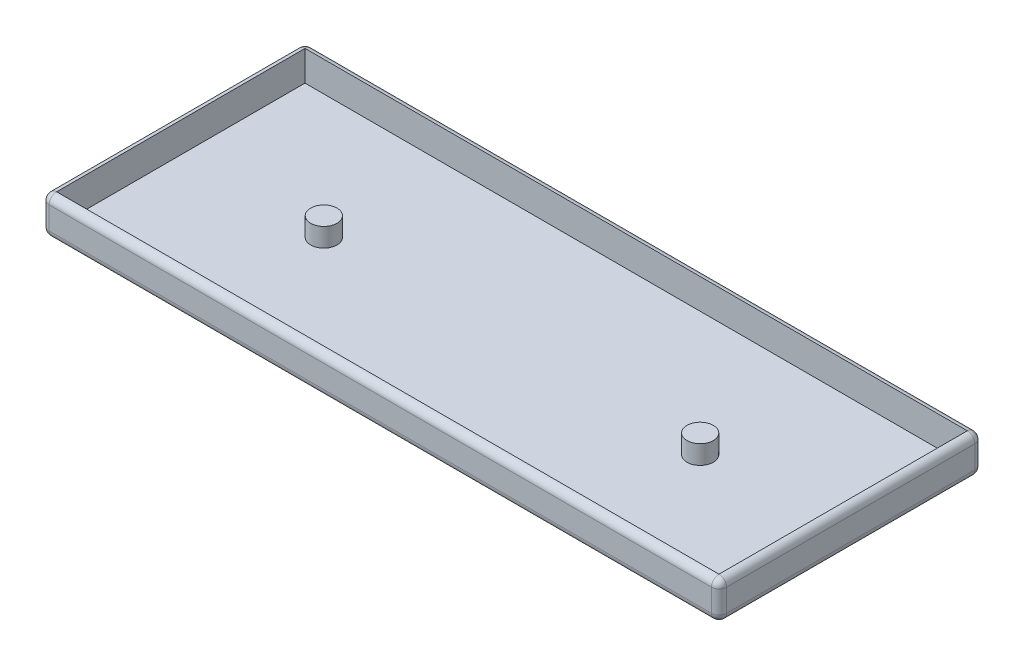
ISO-10303-21;
HEADER;
FILE_DESCRIPTION(('STEP AP214'),'2;1');
FILE_NAME('part.step','',(''),(''),'','','');
FILE_SCHEMA(('AUTOMOTIVE_DESIGN { 1 0 10303 214 1 1 1 1 }'));
ENDSEC;
DATA;
#1=APPLICATION_CONTEXT('core data for automotive mechanical design processes');
#2=APPLICATION_PROTOCOL_DEFINITION('international standard','automotive_design',2000,#1);
#3=PRODUCT_CONTEXT('',#1,'mechanical');
#4=PRODUCT('Part','Part','',(#3));
#5=PRODUCT_RELATED_PRODUCT_CATEGORY('part','',(#4));
#6=PRODUCT_DEFINITION_FORMATION('','',#4);
#7=PRODUCT_DEFINITION_CONTEXT('part definition',#1,'design');
#8=PRODUCT_DEFINITION('design','',#6,#7);
#9=PRODUCT_DEFINITION_SHAPE('','',#8);
#10=(LENGTH_UNIT() NAMED_UNIT(*) SI_UNIT(.MILLI.,.METRE.));
#11=(NAMED_UNIT(*) PLANE_ANGLE_UNIT() SI_UNIT($,.RADIAN.));
#12=(NAMED_UNIT(*) SI_UNIT($,.STERADIAN.) SOLID_ANGLE_UNIT());
#13=UNCERTAINTY_MEASURE_WITH_UNIT(LENGTH_MEASURE(1.E-05),#10,'distance_accuracy_value','');
#14=(GEOMETRIC_REPRESENTATION_CONTEXT(3) GLOBAL_UNCERTAINTY_ASSIGNED_CONTEXT((#13)) GLOBAL_UNIT_ASSIGNED_CONTEXT((#10,
#11,#12)) REPRESENTATION_CONTEXT('',''));
#15=CARTESIAN_POINT('',(0.,0.,0.));
#16=DIRECTION('',(0.,0.,1.));
#17=DIRECTION('',(1.,0.,0.));
#18=AXIS2_PLACEMENT_3D('',#15,#16,#17);
#19=CARTESIAN_POINT('',(90.,10.,35.));
#20=DIRECTION('',(-1.,0.,0.));
#21=DIRECTION('',(0.,0.,1.));
#22=AXIS2_PLACEMENT_3D('',#19,#20,#21);
#23=PLANE('',#22);
#24=DIRECTION('',(0.,-1.,0.));
#25=VECTOR('',#24,1.);
#26=CARTESIAN_POINT('',(90.,10.,33.));
#27=LINE('',#26,#25);
#28=CARTESIAN_POINT('',(90.,8.,33.));
#29=VERTEX_POINT('',#28);
#30=CARTESIAN_POINT('',(90.,2.,33.));
#31=VERTEX_POINT('',#30);
#32=EDGE_CURVE('E191',#29,#31,#27,.T.);
#33=ORIENTED_EDGE('',*,*,#32,.T.);
#34=DIRECTION('',(0.,0.,-1.));
#35=VECTOR('',#34,1.);
#36=CARTESIAN_POINT('',(90.,2.,-35.));
#37=LINE('',#36,#35);
#38=CARTESIAN_POINT('',(90.,2.,-33.));
#39=VERTEX_POINT('',#38);
#40=EDGE_CURVE('E193',#31,#39,#37,.T.);
#41=ORIENTED_EDGE('',*,*,#40,.T.);
#42=DIRECTION('',(0.,-1.,0.));
#43=VECTOR('',#42,1.);
#44=CARTESIAN_POINT('',(90.,10.,-33.));
#45=LINE('',#44,#43);
#46=CARTESIAN_POINT('',(90.,8.,-33.));
#47=VERTEX_POINT('',#46);
#48=EDGE_CURVE('E185',#39,#47,#45,.F.);
#49=ORIENTED_EDGE('',*,*,#48,.T.);
#50=DIRECTION('',(0.,0.,-1.));
#51=VECTOR('',#50,1.);
#52=CARTESIAN_POINT('',(90.,8.,35.));
#53=LINE('',#52,#51);
#54=EDGE_CURVE('E189',#47,#29,#53,.F.);
#55=ORIENTED_EDGE('',*,*,#54,.T.);
#56=EDGE_LOOP('',(#33,#41,#49,#55));
#57=FACE_BOUND('',#56,.T.);
#58=ADVANCED_FACE('F33',(#57),#23,.F.);
#59=CARTESIAN_POINT('',(-90.,10.,-35.));
#60=DIRECTION('',(0.,0.,1.));
#61=DIRECTION('',(1.,0.,0.));
#62=AXIS2_PLACEMENT_3D('',#59,#60,#61);
#63=PLANE('',#62);
#64=DIRECTION('',(-1.,0.,0.));
#65=VECTOR('',#64,1.);
#66=CARTESIAN_POINT('',(-90.,8.,-35.));
#67=LINE('',#66,#65);
#68=CARTESIAN_POINT('',(-88.,8.,-35.));
#69=VERTEX_POINT('',#68);
#70=CARTESIAN_POINT('',(88.,8.,-35.));
#71=VERTEX_POINT('',#70);
#72=EDGE_CURVE('E42',#69,#71,#67,.F.);
#73=ORIENTED_EDGE('',*,*,#72,.T.);
#74=DIRECTION('',(0.,-1.,0.));
#75=VECTOR('',#74,1.);
#76=CARTESIAN_POINT('',(88.,10.,-35.));
#77=LINE('',#76,#75);
#78=CARTESIAN_POINT('',(88.,2.,-35.));
#79=VERTEX_POINT('',#78);
#80=EDGE_CURVE('E11',#71,#79,#77,.T.);
#81=ORIENTED_EDGE('',*,*,#80,.T.);
#82=DIRECTION('',(-1.,0.,0.));
#83=VECTOR('',#82,1.);
#84=CARTESIAN_POINT('',(-90.,2.,-35.));
#85=LINE('',#84,#83);
#86=CARTESIAN_POINT('',(-88.,2.,-35.));
#87=VERTEX_POINT('',#86);
#88=EDGE_CURVE('E232',#79,#87,#85,.T.);
#89=ORIENTED_EDGE('',*,*,#88,.T.);
#90=DIRECTION('',(0.,-1.,0.));
#91=VECTOR('',#90,1.);
#92=CARTESIAN_POINT('',(-88.,10.,-35.));
#93=LINE('',#92,#91);
#94=EDGE_CURVE('E53',#87,#69,#93,.F.);
#95=ORIENTED_EDGE('',*,*,#94,.T.);
#96=EDGE_LOOP('',(#73,#81,#89,#95));
#97=FACE_BOUND('',#96,.T.);
#98=ADVANCED_FACE('F362',(#97),#63,.F.);
#99=CARTESIAN_POINT('',(-90.,10.,35.));
#100=DIRECTION('',(1.,0.,0.));
#101=DIRECTION('',(0.,0.,-1.));
#102=AXIS2_PLACEMENT_3D('',#99,#100,#101);
#103=PLANE('',#102);
#104=DIRECTION('',(0.,0.,1.));
#105=VECTOR('',#104,1.);
#106=CARTESIAN_POINT('',(-90.,2.,35.));
#107=LINE('',#106,#105);
#108=CARTESIAN_POINT('',(-90.,2.,-33.));
#109=VERTEX_POINT('',#108);
#110=CARTESIAN_POINT('',(-90.,2.,33.));
#111=VERTEX_POINT('',#110);
#112=EDGE_CURVE('E218',#109,#111,#107,.T.);
#113=ORIENTED_EDGE('',*,*,#112,.T.);
#114=DIRECTION('',(0.,-1.,0.));
#115=VECTOR('',#114,1.);
#116=CARTESIAN_POINT('',(-90.,10.,33.));
#117=LINE('',#116,#115);
#118=CARTESIAN_POINT('',(-90.,8.,33.));
#119=VERTEX_POINT('',#118);
#120=EDGE_CURVE('E220',#111,#119,#117,.F.);
#121=ORIENTED_EDGE('',*,*,#120,.T.);
#122=DIRECTION('',(0.,0.,1.));
#123=VECTOR('',#122,1.);
#124=CARTESIAN_POINT('',(-90.,8.,35.));
#125=LINE('',#124,#123);
#126=CARTESIAN_POINT('',(-90.,8.,-33.));
#127=VERTEX_POINT('',#126);
#128=EDGE_CURVE('E216',#119,#127,#125,.F.);
#129=ORIENTED_EDGE('',*,*,#128,.T.);
#130=DIRECTION('',(0.,-1.,0.));
#131=VECTOR('',#130,1.);
#132=CARTESIAN_POINT('',(-90.,10.,-33.));
#133=LINE('',#132,#131);
#134=EDGE_CURVE('E214',#127,#109,#133,.T.);
#135=ORIENTED_EDGE('',*,*,#134,.T.);
#136=EDGE_LOOP('',(#113,#121,#129,#135));
#137=FACE_BOUND('',#136,.T.);
#138=ADVANCED_FACE('F313',(#137),#103,.F.);
#139=CARTESIAN_POINT('',(-90.,10.,35.));
#140=DIRECTION('',(0.,0.,-1.));
#141=DIRECTION('',(-1.,0.,0.));
#142=AXIS2_PLACEMENT_3D('',#139,#140,#141);
#143=PLANE('',#142);
#144=DIRECTION('',(1.,0.,0.));
#145=VECTOR('',#144,1.);
#146=CARTESIAN_POINT('',(90.,2.,35.));
#147=LINE('',#146,#145);
#148=CARTESIAN_POINT('',(-88.,2.,35.));
#149=VERTEX_POINT('',#148);
#150=CARTESIAN_POINT('',(88.,2.,35.));
#151=VERTEX_POINT('',#150);
#152=EDGE_CURVE('E209',#149,#151,#147,.T.);
#153=ORIENTED_EDGE('',*,*,#152,.T.);
#154=DIRECTION('',(0.,-1.,0.));
#155=VECTOR('',#154,1.);
#156=CARTESIAN_POINT('',(88.,10.,35.));
#157=LINE('',#156,#155);
#158=CARTESIAN_POINT('',(88.,8.,35.));
#159=VERTEX_POINT('',#158);
#160=EDGE_CURVE('E211',#151,#159,#157,.F.);
#161=ORIENTED_EDGE('',*,*,#160,.T.);
#162=DIRECTION('',(1.,0.,0.));
#163=VECTOR('',#162,1.);
#164=CARTESIAN_POINT('',(-90.,8.,35.));
#165=LINE('',#164,#163);
#166=CARTESIAN_POINT('',(-88.,8.,35.));
#167=VERTEX_POINT('',#166);
#168=EDGE_CURVE('E205',#159,#167,#165,.F.);
#169=ORIENTED_EDGE('',*,*,#168,.T.);
#170=DIRECTION('',(0.,-1.,0.));
#171=VECTOR('',#170,1.);
#172=CARTESIAN_POINT('',(-88.,10.,35.));
#173=LINE('',#172,#171);
#174=EDGE_CURVE('E207',#167,#149,#173,.T.);
#175=ORIENTED_EDGE('',*,*,#174,.T.);
#176=EDGE_LOOP('',(#153,#161,#169,#175));
#177=FACE_BOUND('',#176,.T.);
#178=ADVANCED_FACE('F334',(#177),#143,.F.);
#179=CARTESIAN_POINT('',(0.,0.,0.));
#180=DIRECTION('',(0.,-1.,0.));
#181=DIRECTION('',(0.,0.,-1.));
#182=AXIS2_PLACEMENT_3D('',#179,#180,#181);
#183=PLANE('',#182);
#184=DIRECTION('',(-1.,0.,0.));
#185=VECTOR('',#184,1.);
#186=CARTESIAN_POINT('',(90.,0.,-33.));
#187=LINE('',#186,#185);
#188=CARTESIAN_POINT('',(-88.,0.,-33.));
#189=VERTEX_POINT('',#188);
#190=CARTESIAN_POINT('',(88.,0.,-33.));
#191=VERTEX_POINT('',#190);
#192=EDGE_CURVE('E196',#189,#191,#187,.F.);
#193=ORIENTED_EDGE('',*,*,#192,.T.);
#194=DIRECTION('',(0.,0.,-1.));
#195=VECTOR('',#194,1.);
#196=CARTESIAN_POINT('',(88.,0.,35.));
#197=LINE('',#196,#195);
#198=CARTESIAN_POINT('',(88.,0.,33.));
#199=VERTEX_POINT('',#198);
#200=EDGE_CURVE('E202',#191,#199,#197,.F.);
#201=ORIENTED_EDGE('',*,*,#200,.T.);
#202=DIRECTION('',(1.,0.,0.));
#203=VECTOR('',#202,1.);
#204=CARTESIAN_POINT('',(-90.,0.,33.));
#205=LINE('',#204,#203);
#206=CARTESIAN_POINT('',(-88.,0.,33.));
#207=VERTEX_POINT('',#206);
#208=EDGE_CURVE('E200',#199,#207,#205,.F.);
#209=ORIENTED_EDGE('',*,*,#208,.T.);
#210=DIRECTION('',(0.,0.,1.));
#211=VECTOR('',#210,1.);
#212=CARTESIAN_POINT('',(-88.,0.,-35.));
#213=LINE('',#212,#211);
#214=EDGE_CURVE('E198',#207,#189,#213,.F.);
#215=ORIENTED_EDGE('',*,*,#214,.T.);
#216=EDGE_LOOP('',(#193,#201,#209,#215));
#217=FACE_BOUND('',#216,.T.);
#218=CARTESIAN_POINT('',(-50.,0.,0.));
#219=DIRECTION('',(0.,1.,0.));
#220=DIRECTION('',(0.,0.,-1.));
#221=AXIS2_PLACEMENT_3D('',#218,#219,#220);
#222=CIRCLE('',#221,1.5);
#223=CARTESIAN_POINT('',(-50.,0.,-1.5));
#224=VERTEX_POINT('',#223);
#225=EDGE_CURVE('E179',#224,#224,#222,.T.);
#226=ORIENTED_EDGE('',*,*,#225,.T.);
#227=EDGE_LOOP('',(#226));
#228=FACE_BOUND('',#227,.T.);
#229=CARTESIAN_POINT('',(50.,0.,0.));
#230=DIRECTION('',(0.,-1.,0.));
#231=DIRECTION('',(0.,0.,-1.));
#232=AXIS2_PLACEMENT_3D('',#229,#230,#231);
#233=CIRCLE('',#232,1.5);
#234=CARTESIAN_POINT('',(50.,0.,-1.5));
#235=VERTEX_POINT('',#234);
#236=EDGE_CURVE('E178',#235,#235,#233,.T.);
#237=ORIENTED_EDGE('',*,*,#236,.F.);
#238=EDGE_LOOP('',(#237));
#239=FACE_BOUND('',#238,.T.);
#240=ADVANCED_FACE('F426',(#217,#228,#239),#183,.T.);
#241=CARTESIAN_POINT('',(50.,5.,0.));
#242=DIRECTION('',(0.,-1.,0.));
#243=DIRECTION('',(0.,0.,-1.));
#244=AXIS2_PLACEMENT_3D('',#241,#242,#243);
#245=CYLINDRICAL_SURFACE('',#244,1.5);
#246=CARTESIAN_POINT('',(50.,5.,0.));
#247=DIRECTION('',(0.,-1.,0.));
#248=DIRECTION('',(0.,0.,-1.));
#249=AXIS2_PLACEMENT_3D('',#246,#247,#248);
#250=CIRCLE('',#249,1.5);
#251=CARTESIAN_POINT('',(50.,5.,-1.5));
#252=VERTEX_POINT('',#251);
#253=EDGE_CURVE('E182',#252,#252,#250,.T.);
#254=ORIENTED_EDGE('',*,*,#253,.F.);
#255=EDGE_LOOP('',(#254));
#256=FACE_BOUND('',#255,.T.);
#257=ORIENTED_EDGE('',*,*,#236,.T.);
#258=EDGE_LOOP('',(#257));
#259=FACE_BOUND('',#258,.T.);
#260=ADVANCED_FACE('F482',(#256,#259),#245,.F.);
#261=CARTESIAN_POINT('',(50.,5.,0.));
#262=DIRECTION('',(0.,-1.,0.));
#263=DIRECTION('',(0.,0.,-1.));
#264=AXIS2_PLACEMENT_3D('',#261,#262,#263);
#265=PLANE('',#264);
#266=ORIENTED_EDGE('',*,*,#253,.T.);
#267=EDGE_LOOP('',(#266));
#268=FACE_BOUND('',#267,.T.);
#269=ADVANCED_FACE('F478',(#268),#265,.T.);
#270=CARTESIAN_POINT('',(-50.,5.,0.));
#271=DIRECTION('',(0.,-1.,0.));
#272=DIRECTION('',(0.,0.,-1.));
#273=AXIS2_PLACEMENT_3D('',#270,#271,#272);
#274=CYLINDRICAL_SURFACE('',#273,1.5);
#275=CARTESIAN_POINT('',(-50.,5.,0.));
#276=DIRECTION('',(0.,1.,0.));
#277=DIRECTION('',(0.,0.,-1.));
#278=AXIS2_PLACEMENT_3D('',#275,#276,#277);
#279=CIRCLE('',#278,1.5);
#280=CARTESIAN_POINT('',(-50.,5.,-1.5));
#281=VERTEX_POINT('',#280);
#282=EDGE_CURVE('E175',#281,#281,#279,.T.);
#283=ORIENTED_EDGE('',*,*,#282,.T.);
#284=EDGE_LOOP('',(#283));
#285=FACE_BOUND('',#284,.T.);
#286=ORIENTED_EDGE('',*,*,#225,.F.);
#287=EDGE_LOOP('',(#286));
#288=FACE_BOUND('',#287,.T.);
#289=ADVANCED_FACE('F474',(#285,#288),#274,.F.);
#290=CARTESIAN_POINT('',(-50.,5.,0.));
#291=DIRECTION('',(0.,-1.,0.));
#292=DIRECTION('',(0.,0.,-1.));
#293=AXIS2_PLACEMENT_3D('',#290,#291,#292);
#294=PLANE('',#293);
#295=ORIENTED_EDGE('',*,*,#282,.F.);
#296=EDGE_LOOP('',(#295));
#297=FACE_BOUND('',#296,.T.);
#298=ADVANCED_FACE('F471',(#297),#294,.T.);
#299=CARTESIAN_POINT('',(-88.,8.,0.));
#300=DIRECTION('',(0.,0.,1.));
#301=DIRECTION('',(1.,0.,0.));
#302=AXIS2_PLACEMENT_3D('',#299,#300,#301);
#303=CYLINDRICAL_SURFACE('',#302,2.);
#304=CARTESIAN_POINT('',(-88.,8.,33.));
#305=DIRECTION('',(0.,0.,1.));
#306=DIRECTION('',(1.,0.,0.));
#307=AXIS2_PLACEMENT_3D('',#304,#305,#306);
#308=CIRCLE('',#307,2.);
#309=CARTESIAN_POINT('',(-88.,10.,33.));
#310=VERTEX_POINT('',#309);
#311=EDGE_CURVE('E37',#310,#119,#308,.T.);
#312=ORIENTED_EDGE('',*,*,#311,.F.);
#313=DIRECTION('',(0.,0.,1.));
#314=VECTOR('',#313,1.);
#315=CARTESIAN_POINT('',(-88.,10.,0.));
#316=LINE('',#315,#314);
#317=CARTESIAN_POINT('',(-88.,10.,-33.));
#318=VERTEX_POINT('',#317);
#319=EDGE_CURVE('E228',#318,#310,#316,.T.);
#320=ORIENTED_EDGE('',*,*,#319,.F.);
#321=CARTESIAN_POINT('',(-88.,8.,-33.));
#322=DIRECTION('',(0.,0.,-1.));
#323=DIRECTION('',(-1.,0.,0.));
#324=AXIS2_PLACEMENT_3D('',#321,#322,#323);
#325=CIRCLE('',#324,2.);
#326=EDGE_CURVE('E295',#127,#318,#325,.T.);
#327=ORIENTED_EDGE('',*,*,#326,.F.);
#328=ORIENTED_EDGE('',*,*,#128,.F.);
#329=EDGE_LOOP('',(#312,#320,#327,#328));
#330=FACE_BOUND('',#329,.T.);
#331=ADVANCED_FACE('F35',(#330),#303,.T.);
#332=CARTESIAN_POINT('',(-88.,8.,33.));
#333=DIRECTION('',(-1.,0.,0.));
#334=DIRECTION('',(0.,0.,1.));
#335=AXIS2_PLACEMENT_3D('',#332,#333,#334);
#336=SPHERICAL_SURFACE('',#335,2.);
#337=CARTESIAN_POINT('',(-88.,8.,33.));
#338=DIRECTION('',(-1.,0.,0.));
#339=DIRECTION('',(0.,0.,1.));
#340=AXIS2_PLACEMENT_3D('',#337,#338,#339);
#341=CIRCLE('',#340,2.);
#342=EDGE_CURVE('E291',#310,#167,#341,.F.);
#343=ORIENTED_EDGE('',*,*,#342,.F.);
#344=ORIENTED_EDGE('',*,*,#311,.T.);
#345=CARTESIAN_POINT('',(-88.,8.,33.));
#346=DIRECTION('',(0.,1.,0.));
#347=DIRECTION('',(0.,0.,1.));
#348=AXIS2_PLACEMENT_3D('',#345,#346,#347);
#349=CIRCLE('',#348,2.);
#350=EDGE_CURVE('E294',#167,#119,#349,.F.);
#351=ORIENTED_EDGE('',*,*,#350,.F.);
#352=EDGE_LOOP('',(#343,#344,#351));
#353=FACE_BOUND('',#352,.T.);
#354=ADVANCED_FACE('F307',(#353),#336,.T.);
#355=CARTESIAN_POINT('',(-88.,8.,-33.));
#356=DIRECTION('',(0.,1.,0.));
#357=DIRECTION('',(0.,0.,1.));
#358=AXIS2_PLACEMENT_3D('',#355,#356,#357);
#359=SPHERICAL_SURFACE('',#358,2.);
#360=CARTESIAN_POINT('',(-88.,8.,-33.));
#361=DIRECTION('',(0.,1.,0.));
#362=DIRECTION('',(0.,0.,1.));
#363=AXIS2_PLACEMENT_3D('',#360,#361,#362);
#364=CIRCLE('',#363,2.);
#365=EDGE_CURVE('E286',#127,#69,#364,.F.);
#366=ORIENTED_EDGE('',*,*,#365,.F.);
#367=ORIENTED_EDGE('',*,*,#326,.T.);
#368=CARTESIAN_POINT('',(-88.,8.,-33.));
#369=DIRECTION('',(-1.,0.,0.));
#370=DIRECTION('',(0.,0.,1.));
#371=AXIS2_PLACEMENT_3D('',#368,#369,#370);
#372=CIRCLE('',#371,2.);
#373=EDGE_CURVE('E288',#69,#318,#372,.F.);
#374=ORIENTED_EDGE('',*,*,#373,.F.);
#375=EDGE_LOOP('',(#366,#367,#374));
#376=FACE_BOUND('',#375,.T.);
#377=ADVANCED_FACE('F359',(#376),#359,.T.);
#378=CARTESIAN_POINT('',(-88.,10.,33.));
#379=DIRECTION('',(0.,-1.,0.));
#380=DIRECTION('',(0.,0.,-1.));
#381=AXIS2_PLACEMENT_3D('',#378,#379,#380);
#382=CYLINDRICAL_SURFACE('',#381,2.);
#383=ORIENTED_EDGE('',*,*,#350,.T.);
#384=ORIENTED_EDGE('',*,*,#120,.F.);
#385=CARTESIAN_POINT('',(-88.,2.,33.));
#386=DIRECTION('',(0.,-1.,0.));
#387=DIRECTION('',(0.,0.,-1.));
#388=AXIS2_PLACEMENT_3D('',#385,#386,#387);
#389=CIRCLE('',#388,2.);
#390=EDGE_CURVE('E280',#149,#111,#389,.T.);
#391=ORIENTED_EDGE('',*,*,#390,.F.);
#392=ORIENTED_EDGE('',*,*,#174,.F.);
#393=EDGE_LOOP('',(#383,#384,#391,#392));
#394=FACE_BOUND('',#393,.T.);
#395=ADVANCED_FACE('F318',(#394),#382,.T.);
#396=CARTESIAN_POINT('',(0.,8.,33.));
#397=DIRECTION('',(1.,0.,0.));
#398=DIRECTION('',(0.,0.,-1.));
#399=AXIS2_PLACEMENT_3D('',#396,#397,#398);
#400=CYLINDRICAL_SURFACE('',#399,2.);
#401=ORIENTED_EDGE('',*,*,#342,.T.);
#402=ORIENTED_EDGE('',*,*,#168,.F.);
#403=CARTESIAN_POINT('',(88.,8.,33.));
#404=DIRECTION('',(1.,0.,0.));
#405=DIRECTION('',(0.,0.,-1.));
#406=AXIS2_PLACEMENT_3D('',#403,#404,#405);
#407=CIRCLE('',#406,2.);
#408=CARTESIAN_POINT('',(88.,10.,33.));
#409=VERTEX_POINT('',#408);
#410=EDGE_CURVE('E277',#409,#159,#407,.T.);
#411=ORIENTED_EDGE('',*,*,#410,.F.);
#412=DIRECTION('',(1.,0.,0.));
#413=VECTOR('',#412,1.);
#414=CARTESIAN_POINT('',(0.,10.,33.));
#415=LINE('',#414,#413);
#416=EDGE_CURVE('E141',#310,#409,#415,.T.);
#417=ORIENTED_EDGE('',*,*,#416,.F.);
#418=EDGE_LOOP('',(#401,#402,#411,#417));
#419=FACE_BOUND('',#418,.T.);
#420=ADVANCED_FACE('F348',(#419),#400,.T.);
#421=CARTESIAN_POINT('',(88.,8.,0.));
#422=DIRECTION('',(0.,0.,-1.));
#423=DIRECTION('',(-1.,0.,0.));
#424=AXIS2_PLACEMENT_3D('',#421,#422,#423);
#425=CYLINDRICAL_SURFACE('',#424,2.);
#426=CARTESIAN_POINT('',(88.,8.,-33.));
#427=DIRECTION('',(0.,0.,-1.));
#428=DIRECTION('',(-1.,0.,0.));
#429=AXIS2_PLACEMENT_3D('',#426,#427,#428);
#430=CIRCLE('',#429,2.);
#431=CARTESIAN_POINT('',(88.,10.,-33.));
#432=VERTEX_POINT('',#431);
#433=EDGE_CURVE('E272',#432,#47,#430,.T.);
#434=ORIENTED_EDGE('',*,*,#433,.F.);
#435=DIRECTION('',(0.,0.,-1.));
#436=VECTOR('',#435,1.);
#437=CARTESIAN_POINT('',(88.,10.,0.));
#438=LINE('',#437,#436);
#439=EDGE_CURVE('E226',#409,#432,#438,.T.);
#440=ORIENTED_EDGE('',*,*,#439,.F.);
#441=CARTESIAN_POINT('',(88.,8.,33.));
#442=DIRECTION('',(0.,0.,1.));
#443=DIRECTION('',(1.,0.,0.));
#444=AXIS2_PLACEMENT_3D('',#441,#442,#443);
#445=CIRCLE('',#444,2.);
#446=EDGE_CURVE('E275',#29,#409,#445,.T.);
#447=ORIENTED_EDGE('',*,*,#446,.F.);
#448=ORIENTED_EDGE('',*,*,#54,.F.);
#449=EDGE_LOOP('',(#434,#440,#447,#448));
#450=FACE_BOUND('',#449,.T.);
#451=ADVANCED_FACE('F350',(#450),#425,.T.);
#452=CARTESIAN_POINT('',(0.,8.,-33.));
#453=DIRECTION('',(-1.,0.,0.));
#454=DIRECTION('',(0.,0.,1.));
#455=AXIS2_PLACEMENT_3D('',#452,#453,#454);
#456=CYLINDRICAL_SURFACE('',#455,2.);
#457=ORIENTED_EDGE('',*,*,#373,.T.);
#458=DIRECTION('',(-1.,0.,0.));
#459=VECTOR('',#458,1.);
#460=CARTESIAN_POINT('',(0.,10.,-33.));
#461=LINE('',#460,#459);
#462=EDGE_CURVE('E223',#432,#318,#461,.T.);
#463=ORIENTED_EDGE('',*,*,#462,.F.);
#464=CARTESIAN_POINT('',(88.,8.,-33.));
#465=DIRECTION('',(1.,0.,0.));
#466=DIRECTION('',(0.,0.,-1.));
#467=AXIS2_PLACEMENT_3D('',#464,#465,#466);
#468=CIRCLE('',#467,2.);
#469=EDGE_CURVE('E269',#71,#432,#468,.T.);
#470=ORIENTED_EDGE('',*,*,#469,.F.);
#471=ORIENTED_EDGE('',*,*,#72,.F.);
#472=EDGE_LOOP('',(#457,#463,#470,#471));
#473=FACE_BOUND('',#472,.T.);
#474=ADVANCED_FACE('F356',(#473),#456,.T.);
#475=CARTESIAN_POINT('',(-88.,10.,-33.));
#476=DIRECTION('',(0.,-1.,0.));
#477=DIRECTION('',(0.,0.,-1.));
#478=AXIS2_PLACEMENT_3D('',#475,#476,#477);
#479=CYLINDRICAL_SURFACE('',#478,2.);
#480=ORIENTED_EDGE('',*,*,#365,.T.);
#481=ORIENTED_EDGE('',*,*,#94,.F.);
#482=CARTESIAN_POINT('',(-88.,2.,-33.));
#483=DIRECTION('',(0.,-1.,0.));
#484=DIRECTION('',(0.,0.,-1.));
#485=AXIS2_PLACEMENT_3D('',#482,#483,#484);
#486=CIRCLE('',#485,2.);
#487=EDGE_CURVE('E266',#109,#87,#486,.T.);
#488=ORIENTED_EDGE('',*,*,#487,.F.);
#489=ORIENTED_EDGE('',*,*,#134,.F.);
#490=EDGE_LOOP('',(#480,#481,#488,#489));
#491=FACE_BOUND('',#490,.T.);
#492=ADVANCED_FACE('F409',(#491),#479,.T.);
#493=CARTESIAN_POINT('',(-88.,2.,35.));
#494=DIRECTION('',(0.,0.,-1.));
#495=DIRECTION('',(-1.,0.,0.));
#496=AXIS2_PLACEMENT_3D('',#493,#494,#495);
#497=CYLINDRICAL_SURFACE('',#496,2.);
#498=CARTESIAN_POINT('',(-88.,2.,33.));
#499=DIRECTION('',(0.,0.,1.));
#500=DIRECTION('',(1.,0.,0.));
#501=AXIS2_PLACEMENT_3D('',#498,#499,#500);
#502=CIRCLE('',#501,2.);
#503=EDGE_CURVE('E283',#111,#207,#502,.T.);
#504=ORIENTED_EDGE('',*,*,#503,.F.);
#505=ORIENTED_EDGE('',*,*,#112,.F.);
#506=CARTESIAN_POINT('',(-88.,2.,-33.));
#507=DIRECTION('',(0.,0.,-1.));
#508=DIRECTION('',(-1.,0.,0.));
#509=AXIS2_PLACEMENT_3D('',#506,#507,#508);
#510=CIRCLE('',#509,2.);
#511=EDGE_CURVE('E263',#189,#109,#510,.T.);
#512=ORIENTED_EDGE('',*,*,#511,.F.);
#513=ORIENTED_EDGE('',*,*,#214,.F.);
#514=EDGE_LOOP('',(#504,#505,#512,#513));
#515=FACE_BOUND('',#514,.T.);
#516=ADVANCED_FACE('F322',(#515),#497,.T.);
#517=CARTESIAN_POINT('',(-88.,2.,33.));
#518=DIRECTION('',(-1.,0.,0.));
#519=DIRECTION('',(0.,0.,1.));
#520=AXIS2_PLACEMENT_3D('',#517,#518,#519);
#521=SPHERICAL_SURFACE('',#520,2.);
#522=ORIENTED_EDGE('',*,*,#390,.T.);
#523=ORIENTED_EDGE('',*,*,#503,.T.);
#524=CARTESIAN_POINT('',(-88.,2.,33.));
#525=DIRECTION('',(-1.,0.,0.));
#526=DIRECTION('',(0.,0.,1.));
#527=AXIS2_PLACEMENT_3D('',#524,#525,#526);
#528=CIRCLE('',#527,2.);
#529=EDGE_CURVE('E260',#149,#207,#528,.F.);
#530=ORIENTED_EDGE('',*,*,#529,.F.);
#531=EDGE_LOOP('',(#522,#523,#530));
#532=FACE_BOUND('',#531,.T.);
#533=ADVANCED_FACE('F326',(#532),#521,.T.);
#534=CARTESIAN_POINT('',(88.,8.,33.));
#535=DIRECTION('',(0.,1.,0.));
#536=DIRECTION('',(0.,0.,1.));
#537=AXIS2_PLACEMENT_3D('',#534,#535,#536);
#538=SPHERICAL_SURFACE('',#537,2.);
#539=ORIENTED_EDGE('',*,*,#446,.T.);
#540=ORIENTED_EDGE('',*,*,#410,.T.);
#541=CARTESIAN_POINT('',(88.,8.,33.));
#542=DIRECTION('',(0.,1.,0.));
#543=DIRECTION('',(0.,0.,1.));
#544=AXIS2_PLACEMENT_3D('',#541,#542,#543);
#545=CIRCLE('',#544,2.);
#546=EDGE_CURVE('E258',#29,#159,#545,.F.);
#547=ORIENTED_EDGE('',*,*,#546,.F.);
#548=EDGE_LOOP('',(#539,#540,#547));
#549=FACE_BOUND('',#548,.T.);
#550=ADVANCED_FACE('F344',(#549),#538,.T.);
#551=CARTESIAN_POINT('',(88.,8.,-33.));
#552=DIRECTION('',(0.,1.,0.));
#553=DIRECTION('',(0.,0.,1.));
#554=AXIS2_PLACEMENT_3D('',#551,#552,#553);
#555=SPHERICAL_SURFACE('',#554,2.);
#556=ORIENTED_EDGE('',*,*,#469,.T.);
#557=ORIENTED_EDGE('',*,*,#433,.T.);
#558=CARTESIAN_POINT('',(88.,8.,-33.));
#559=DIRECTION('',(0.,1.,0.));
#560=DIRECTION('',(0.,0.,1.));
#561=AXIS2_PLACEMENT_3D('',#558,#559,#560);
#562=CIRCLE('',#561,2.);
#563=EDGE_CURVE('E255',#71,#47,#562,.F.);
#564=ORIENTED_EDGE('',*,*,#563,.F.);
#565=EDGE_LOOP('',(#556,#557,#564));
#566=FACE_BOUND('',#565,.T.);
#567=ADVANCED_FACE('F398',(#566),#555,.T.);
#568=CARTESIAN_POINT('',(-88.,2.,-33.));
#569=DIRECTION('',(-1.,0.,0.));
#570=DIRECTION('',(0.,0.,1.));
#571=AXIS2_PLACEMENT_3D('',#568,#569,#570);
#572=SPHERICAL_SURFACE('',#571,2.);
#573=ORIENTED_EDGE('',*,*,#511,.T.);
#574=ORIENTED_EDGE('',*,*,#487,.T.);
#575=CARTESIAN_POINT('',(-88.,2.,-33.));
#576=DIRECTION('',(-1.,0.,0.));
#577=DIRECTION('',(0.,0.,1.));
#578=AXIS2_PLACEMENT_3D('',#575,#576,#577);
#579=CIRCLE('',#578,2.);
#580=EDGE_CURVE('E252',#189,#87,#579,.F.);
#581=ORIENTED_EDGE('',*,*,#580,.F.);
#582=EDGE_LOOP('',(#573,#574,#581));
#583=FACE_BOUND('',#582,.T.);
#584=ADVANCED_FACE('F395',(#583),#572,.T.);
#585=CARTESIAN_POINT('',(-90.,2.,33.));
#586=DIRECTION('',(-1.,0.,0.));
#587=DIRECTION('',(0.,0.,1.));
#588=AXIS2_PLACEMENT_3D('',#585,#586,#587);
#589=CYLINDRICAL_SURFACE('',#588,2.);
#590=ORIENTED_EDGE('',*,*,#529,.T.);
#591=ORIENTED_EDGE('',*,*,#208,.F.);
#592=CARTESIAN_POINT('',(88.,2.,33.));
#593=DIRECTION('',(1.,0.,0.));
#594=DIRECTION('',(0.,0.,-1.));
#595=AXIS2_PLACEMENT_3D('',#592,#593,#594);
#596=CIRCLE('',#595,2.);
#597=EDGE_CURVE('E249',#151,#199,#596,.T.);
#598=ORIENTED_EDGE('',*,*,#597,.F.);
#599=ORIENTED_EDGE('',*,*,#152,.F.);
#600=EDGE_LOOP('',(#590,#591,#598,#599));
#601=FACE_BOUND('',#600,.T.);
#602=ADVANCED_FACE('F331',(#601),#589,.T.);
#603=CARTESIAN_POINT('',(88.,10.,33.));
#604=DIRECTION('',(0.,-1.,0.));
#605=DIRECTION('',(0.,0.,-1.));
#606=AXIS2_PLACEMENT_3D('',#603,#604,#605);
#607=CYLINDRICAL_SURFACE('',#606,2.);
#608=ORIENTED_EDGE('',*,*,#546,.T.);
#609=ORIENTED_EDGE('',*,*,#160,.F.);
#610=CARTESIAN_POINT('',(88.,2.,33.));
#611=DIRECTION('',(0.,-1.,0.));
#612=DIRECTION('',(0.,0.,-1.));
#613=AXIS2_PLACEMENT_3D('',#610,#611,#612);
#614=CIRCLE('',#613,2.);
#615=EDGE_CURVE('E246',#31,#151,#614,.T.);
#616=ORIENTED_EDGE('',*,*,#615,.F.);
#617=ORIENTED_EDGE('',*,*,#32,.F.);
#618=EDGE_LOOP('',(#608,#609,#616,#617));
#619=FACE_BOUND('',#618,.T.);
#620=ADVANCED_FACE('F337',(#619),#607,.T.);
#621=CARTESIAN_POINT('',(88.,10.,-33.));
#622=DIRECTION('',(0.,-1.,0.));
#623=DIRECTION('',(0.,0.,-1.));
#624=AXIS2_PLACEMENT_3D('',#621,#622,#623);
#625=CYLINDRICAL_SURFACE('',#624,2.);
#626=ORIENTED_EDGE('',*,*,#563,.T.);
#627=ORIENTED_EDGE('',*,*,#48,.F.);
#628=CARTESIAN_POINT('',(88.,2.,-33.));
#629=DIRECTION('',(0.,-1.,0.));
#630=DIRECTION('',(0.,0.,-1.));
#631=AXIS2_PLACEMENT_3D('',#628,#629,#630);
#632=CIRCLE('',#631,2.);
#633=EDGE_CURVE('E243',#79,#39,#632,.T.);
#634=ORIENTED_EDGE('',*,*,#633,.F.);
#635=ORIENTED_EDGE('',*,*,#80,.F.);
#636=EDGE_LOOP('',(#626,#627,#634,#635));
#637=FACE_BOUND('',#636,.T.);
#638=ADVANCED_FACE('F386',(#637),#625,.T.);
#639=CARTESIAN_POINT('',(-90.,2.,-33.));
#640=DIRECTION('',(1.,0.,0.));
#641=DIRECTION('',(0.,0.,-1.));
#642=AXIS2_PLACEMENT_3D('',#639,#640,#641);
#643=CYLINDRICAL_SURFACE('',#642,2.);
#644=ORIENTED_EDGE('',*,*,#580,.T.);
#645=ORIENTED_EDGE('',*,*,#88,.F.);
#646=CARTESIAN_POINT('',(88.,2.,-33.));
#647=DIRECTION('',(1.,0.,0.));
#648=DIRECTION('',(0.,0.,-1.));
#649=AXIS2_PLACEMENT_3D('',#646,#647,#648);
#650=CIRCLE('',#649,2.);
#651=EDGE_CURVE('E241',#191,#79,#650,.T.);
#652=ORIENTED_EDGE('',*,*,#651,.F.);
#653=ORIENTED_EDGE('',*,*,#192,.F.);
#654=EDGE_LOOP('',(#644,#645,#652,#653));
#655=FACE_BOUND('',#654,.T.);
#656=ADVANCED_FACE('F382',(#655),#643,.T.);
#657=CARTESIAN_POINT('',(88.,2.,33.));
#658=DIRECTION('',(0.,0.,1.));
#659=DIRECTION('',(1.,0.,0.));
#660=AXIS2_PLACEMENT_3D('',#657,#658,#659);
#661=SPHERICAL_SURFACE('',#660,2.);
#662=ORIENTED_EDGE('',*,*,#615,.T.);
#663=ORIENTED_EDGE('',*,*,#597,.T.);
#664=CARTESIAN_POINT('',(88.,2.,33.));
#665=DIRECTION('',(0.,0.,1.));
#666=DIRECTION('',(1.,0.,0.));
#667=AXIS2_PLACEMENT_3D('',#664,#665,#666);
#668=CIRCLE('',#667,2.);
#669=EDGE_CURVE('E238',#31,#199,#668,.F.);
#670=ORIENTED_EDGE('',*,*,#669,.F.);
#671=EDGE_LOOP('',(#662,#663,#670));
#672=FACE_BOUND('',#671,.T.);
#673=ADVANCED_FACE('F378',(#672),#661,.T.);
#674=CARTESIAN_POINT('',(88.,2.,-33.));
#675=DIRECTION('',(0.,0.,-1.));
#676=DIRECTION('',(-1.,0.,0.));
#677=AXIS2_PLACEMENT_3D('',#674,#675,#676);
#678=SPHERICAL_SURFACE('',#677,2.);
#679=ORIENTED_EDGE('',*,*,#651,.T.);
#680=ORIENTED_EDGE('',*,*,#633,.T.);
#681=CARTESIAN_POINT('',(88.,2.,-33.));
#682=DIRECTION('',(0.,0.,-1.));
#683=DIRECTION('',(-1.,0.,0.));
#684=AXIS2_PLACEMENT_3D('',#681,#682,#683);
#685=CIRCLE('',#684,2.);
#686=EDGE_CURVE('E236',#191,#39,#685,.F.);
#687=ORIENTED_EDGE('',*,*,#686,.F.);
#688=EDGE_LOOP('',(#679,#680,#687));
#689=FACE_BOUND('',#688,.T.);
#690=ADVANCED_FACE('F374',(#689),#678,.T.);
#691=CARTESIAN_POINT('',(88.,2.,35.));
#692=DIRECTION('',(0.,0.,1.));
#693=DIRECTION('',(1.,0.,0.));
#694=AXIS2_PLACEMENT_3D('',#691,#692,#693);
#695=CYLINDRICAL_SURFACE('',#694,2.);
#696=ORIENTED_EDGE('',*,*,#669,.T.);
#697=ORIENTED_EDGE('',*,*,#200,.F.);
#698=ORIENTED_EDGE('',*,*,#686,.T.);
#699=ORIENTED_EDGE('',*,*,#40,.F.);
#700=EDGE_LOOP('',(#696,#697,#698,#699));
#701=FACE_BOUND('',#700,.T.);
#702=ADVANCED_FACE('F371',(#701),#695,.T.);
#703=CARTESIAN_POINT('',(88.,10.,35.));
#704=DIRECTION('',(-1.,0.,0.));
#705=DIRECTION('',(0.,0.,1.));
#706=AXIS2_PLACEMENT_3D('',#703,#704,#705);
#707=PLANE('',#706);
#708=DIRECTION('',(0.,1.,0.));
#709=VECTOR('',#708,1.);
#710=CARTESIAN_POINT('',(88.,10.,33.));
#711=LINE('',#710,#709);
#712=CARTESIAN_POINT('',(88.,2.,33.));
#713=VERTEX_POINT('',#712);
#714=EDGE_CURVE('E134',#713,#409,#711,.T.);
#715=ORIENTED_EDGE('',*,*,#714,.T.);
#716=ORIENTED_EDGE('',*,*,#439,.T.);
#717=DIRECTION('',(0.,1.,0.));
#718=VECTOR('',#717,1.);
#719=CARTESIAN_POINT('',(88.,10.,-33.));
#720=LINE('',#719,#718);
#721=CARTESIAN_POINT('',(88.,2.,-33.));
#722=VERTEX_POINT('',#721);
#723=EDGE_CURVE('E151',#722,#432,#720,.T.);
#724=ORIENTED_EDGE('',*,*,#723,.F.);
#725=DIRECTION('',(0.,0.,1.));
#726=VECTOR('',#725,1.);
#727=CARTESIAN_POINT('',(88.,2.,35.));
#728=LINE('',#727,#726);
#729=EDGE_CURVE('E145',#722,#713,#728,.T.);
#730=ORIENTED_EDGE('',*,*,#729,.T.);
#731=EDGE_LOOP('',(#715,#716,#724,#730));
#732=FACE_BOUND('',#731,.T.);
#733=ADVANCED_FACE('F149',(#732),#707,.T.);
#734=CARTESIAN_POINT('',(-90.,10.,-33.));
#735=DIRECTION('',(0.,0.,1.));
#736=DIRECTION('',(1.,0.,0.));
#737=AXIS2_PLACEMENT_3D('',#734,#735,#736);
#738=PLANE('',#737);
#739=ORIENTED_EDGE('',*,*,#462,.T.);
#740=DIRECTION('',(0.,1.,0.));
#741=VECTOR('',#740,1.);
#742=CARTESIAN_POINT('',(-88.,10.,-33.));
#743=LINE('',#742,#741);
#744=CARTESIAN_POINT('',(-88.,2.,-33.));
#745=VERTEX_POINT('',#744);
#746=EDGE_CURVE('E239',#745,#318,#743,.T.);
#747=ORIENTED_EDGE('',*,*,#746,.F.);
#748=DIRECTION('',(-1.,0.,0.));
#749=VECTOR('',#748,1.);
#750=CARTESIAN_POINT('',(0.,2.,-33.));
#751=LINE('',#750,#749);
#752=EDGE_CURVE('E438',#722,#745,#751,.T.);
#753=ORIENTED_EDGE('',*,*,#752,.F.);
#754=ORIENTED_EDGE('',*,*,#723,.T.);
#755=EDGE_LOOP('',(#739,#747,#753,#754));
#756=FACE_BOUND('',#755,.T.);
#757=ADVANCED_FACE('F436',(#756),#738,.T.);
#758=CARTESIAN_POINT('',(-88.,10.,35.));
#759=DIRECTION('',(1.,0.,0.));
#760=DIRECTION('',(0.,0.,-1.));
#761=AXIS2_PLACEMENT_3D('',#758,#759,#760);
#762=PLANE('',#761);
#763=DIRECTION('',(0.,0.,1.));
#764=VECTOR('',#763,1.);
#765=CARTESIAN_POINT('',(-88.,2.,0.));
#766=LINE('',#765,#764);
#767=CARTESIAN_POINT('',(-88.,2.,33.));
#768=VERTEX_POINT('',#767);
#769=EDGE_CURVE('E144',#745,#768,#766,.T.);
#770=ORIENTED_EDGE('',*,*,#769,.F.);
#771=ORIENTED_EDGE('',*,*,#746,.T.);
#772=ORIENTED_EDGE('',*,*,#319,.T.);
#773=DIRECTION('',(0.,1.,0.));
#774=VECTOR('',#773,1.);
#775=CARTESIAN_POINT('',(-88.,10.,33.));
#776=LINE('',#775,#774);
#777=EDGE_CURVE('E162',#768,#310,#776,.T.);
#778=ORIENTED_EDGE('',*,*,#777,.F.);
#779=EDGE_LOOP('',(#770,#771,#772,#778));
#780=FACE_BOUND('',#779,.T.);
#781=ADVANCED_FACE('F442',(#780),#762,.T.);
#782=CARTESIAN_POINT('',(-90.,10.,33.));
#783=DIRECTION('',(0.,0.,-1.));
#784=DIRECTION('',(-1.,0.,0.));
#785=AXIS2_PLACEMENT_3D('',#782,#783,#784);
#786=PLANE('',#785);
#787=DIRECTION('',(-1.,0.,0.));
#788=VECTOR('',#787,1.);
#789=CARTESIAN_POINT('',(-90.,2.,33.));
#790=LINE('',#789,#788);
#791=EDGE_CURVE('E138',#713,#768,#790,.T.);
#792=ORIENTED_EDGE('',*,*,#791,.T.);
#793=ORIENTED_EDGE('',*,*,#777,.T.);
#794=ORIENTED_EDGE('',*,*,#416,.T.);
#795=ORIENTED_EDGE('',*,*,#714,.F.);
#796=EDGE_LOOP('',(#792,#793,#794,#795));
#797=FACE_BOUND('',#796,.T.);
#798=ADVANCED_FACE('F136',(#797),#786,.T.);
#799=CARTESIAN_POINT('',(0.,2.,0.));
#800=DIRECTION('',(0.,-1.,0.));
#801=DIRECTION('',(0.,0.,-1.));
#802=AXIS2_PLACEMENT_3D('',#799,#800,#801);
#803=PLANE('',#802);
#804=ORIENTED_EDGE('',*,*,#752,.T.);
#805=ORIENTED_EDGE('',*,*,#769,.T.);
#806=ORIENTED_EDGE('',*,*,#791,.F.);
#807=ORIENTED_EDGE('',*,*,#729,.F.);
#808=EDGE_LOOP('',(#804,#805,#806,#807));
#809=FACE_BOUND('',#808,.T.);
#810=CARTESIAN_POINT('',(-50.,2.,0.));
#811=DIRECTION('',(0.,-1.,0.));
#812=DIRECTION('',(0.,0.,-1.));
#813=AXIS2_PLACEMENT_3D('',#810,#811,#812);
#814=CIRCLE('',#813,3.5);
#815=CARTESIAN_POINT('',(-50.,2.,-3.5));
#816=VERTEX_POINT('',#815);
#817=EDGE_CURVE('E164',#816,#816,#814,.F.);
#818=ORIENTED_EDGE('',*,*,#817,.F.);
#819=EDGE_LOOP('',(#818));
#820=FACE_BOUND('',#819,.T.);
#821=CARTESIAN_POINT('',(50.,2.,0.));
#822=DIRECTION('',(0.,-1.,0.));
#823=DIRECTION('',(0.,0.,-1.));
#824=AXIS2_PLACEMENT_3D('',#821,#822,#823);
#825=CIRCLE('',#824,3.5);
#826=CARTESIAN_POINT('',(50.,2.,-3.5));
#827=VERTEX_POINT('',#826);
#828=EDGE_CURVE('E168',#827,#827,#825,.T.);
#829=ORIENTED_EDGE('',*,*,#828,.T.);
#830=EDGE_LOOP('',(#829));
#831=FACE_BOUND('',#830,.T.);
#832=ADVANCED_FACE('F155',(#809,#820,#831),#803,.F.);
#833=CARTESIAN_POINT('',(50.,5.,0.));
#834=DIRECTION('',(0.,-1.,0.));
#835=DIRECTION('',(0.,0.,-1.));
#836=AXIS2_PLACEMENT_3D('',#833,#834,#835);
#837=CYLINDRICAL_SURFACE('',#836,3.5);
#838=CARTESIAN_POINT('',(50.,7.,0.));
#839=DIRECTION('',(0.,-1.,0.));
#840=DIRECTION('',(0.,0.,-1.));
#841=AXIS2_PLACEMENT_3D('',#838,#839,#840);
#842=CIRCLE('',#841,3.5);
#843=CARTESIAN_POINT('',(50.,7.,-3.5));
#844=VERTEX_POINT('',#843);
#845=EDGE_CURVE('E158',#844,#844,#842,.T.);
#846=ORIENTED_EDGE('',*,*,#845,.T.);
#847=EDGE_LOOP('',(#846));
#848=FACE_BOUND('',#847,.T.);
#849=ORIENTED_EDGE('',*,*,#828,.F.);
#850=EDGE_LOOP('',(#849));
#851=FACE_BOUND('',#850,.T.);
#852=ADVANCED_FACE('F455',(#848,#851),#837,.T.);
#853=CARTESIAN_POINT('',(50.,7.,0.));
#854=DIRECTION('',(0.,-1.,0.));
#855=DIRECTION('',(0.,0.,-1.));
#856=AXIS2_PLACEMENT_3D('',#853,#854,#855);
#857=PLANE('',#856);
#858=ORIENTED_EDGE('',*,*,#845,.F.);
#859=EDGE_LOOP('',(#858));
#860=FACE_BOUND('',#859,.T.);
#861=ADVANCED_FACE('F458',(#860),#857,.F.);
#862=CARTESIAN_POINT('',(-50.,5.,0.));
#863=DIRECTION('',(0.,-1.,0.));
#864=DIRECTION('',(0.,0.,-1.));
#865=AXIS2_PLACEMENT_3D('',#862,#863,#864);
#866=CYLINDRICAL_SURFACE('',#865,3.5);
#867=CARTESIAN_POINT('',(-50.,7.,0.));
#868=DIRECTION('',(0.,-1.,0.));
#869=DIRECTION('',(0.,0.,-1.));
#870=AXIS2_PLACEMENT_3D('',#867,#868,#869);
#871=CIRCLE('',#870,3.5);
#872=CARTESIAN_POINT('',(-50.,7.,-3.5));
#873=VERTEX_POINT('',#872);
#874=EDGE_CURVE('E167',#873,#873,#871,.F.);
#875=ORIENTED_EDGE('',*,*,#874,.F.);
#876=EDGE_LOOP('',(#875));
#877=FACE_BOUND('',#876,.T.);
#878=ORIENTED_EDGE('',*,*,#817,.T.);
#879=EDGE_LOOP('',(#878));
#880=FACE_BOUND('',#879,.T.);
#881=ADVANCED_FACE('F462',(#877,#880),#866,.T.);
#882=CARTESIAN_POINT('',(-50.,7.,0.));
#883=DIRECTION('',(0.,-1.,0.));
#884=DIRECTION('',(0.,0.,-1.));
#885=AXIS2_PLACEMENT_3D('',#882,#883,#884);
#886=PLANE('',#885);
#887=ORIENTED_EDGE('',*,*,#874,.T.);
#888=EDGE_LOOP('',(#887));
#889=FACE_BOUND('',#888,.T.);
#890=ADVANCED_FACE('F466',(#889),#886,.F.);
#891=CLOSED_SHELL('',(#58,#98,#138,#178,#240,#260,#269,#289,#298,#331,#354,#377,#395,#420,#451,
#474,#492,#516,#533,#550,#567,#584,#602,#620,#638,#656,#673,#690,#702,#733,#757,#781,#798,#832,
#852,#861,#881,#890));
#892=MANIFOLD_SOLID_BREP('B2',#891);
#893=ADVANCED_BREP_SHAPE_REPRESENTATION('',(#18,#892),#14);
#894=SHAPE_DEFINITION_REPRESENTATION(#9,#893);
ENDSEC;
END-ISO-10303-21;
